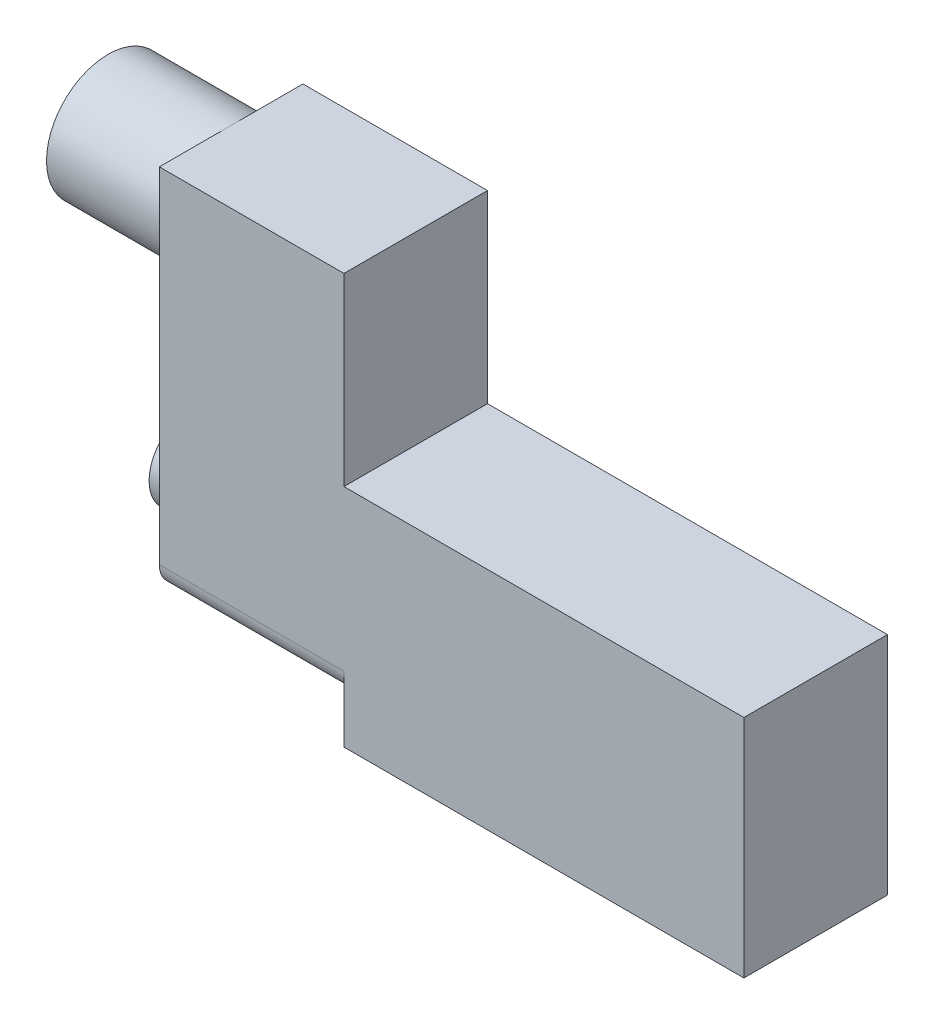
ISO-10303-21;
HEADER;
FILE_DESCRIPTION(('STEP AP214'),'2;1');
FILE_NAME('part.step','',(''),(''),'','','');
FILE_SCHEMA(('AUTOMOTIVE_DESIGN { 1 0 10303 214 1 1 1 1 }'));
ENDSEC;
DATA;
#1=APPLICATION_CONTEXT('core data for automotive mechanical design processes');
#2=APPLICATION_PROTOCOL_DEFINITION('international standard','automotive_design',2000,#1);
#3=PRODUCT_CONTEXT('',#1,'mechanical');
#4=PRODUCT('Part','Part','',(#3));
#5=PRODUCT_RELATED_PRODUCT_CATEGORY('part','',(#4));
#6=PRODUCT_DEFINITION_FORMATION('','',#4);
#7=PRODUCT_DEFINITION_CONTEXT('part definition',#1,'design');
#8=PRODUCT_DEFINITION('design','',#6,#7);
#9=PRODUCT_DEFINITION_SHAPE('','',#8);
#10=(LENGTH_UNIT() NAMED_UNIT(*) SI_UNIT(.MILLI.,.METRE.));
#11=(NAMED_UNIT(*) PLANE_ANGLE_UNIT() SI_UNIT($,.RADIAN.));
#12=(NAMED_UNIT(*) SI_UNIT($,.STERADIAN.) SOLID_ANGLE_UNIT());
#13=UNCERTAINTY_MEASURE_WITH_UNIT(LENGTH_MEASURE(1.E-05),#10,'distance_accuracy_value','');
#14=(GEOMETRIC_REPRESENTATION_CONTEXT(3) GLOBAL_UNCERTAINTY_ASSIGNED_CONTEXT((#13)) GLOBAL_UNIT_ASSIGNED_CONTEXT((#10,
#11,#12)) REPRESENTATION_CONTEXT('',''));
#15=CARTESIAN_POINT('',(0.,0.,0.));
#16=DIRECTION('',(0.,0.,1.));
#17=DIRECTION('',(1.,0.,0.));
#18=AXIS2_PLACEMENT_3D('',#15,#16,#17);
#19=CARTESIAN_POINT('',(-28.575,0.,0.));
#20=DIRECTION('',(-1.,0.,0.));
#21=DIRECTION('',(0.,0.,1.));
#22=AXIS2_PLACEMENT_3D('',#19,#20,#21);
#23=PLANE('',#22);
#24=CARTESIAN_POINT('',(-28.575,15.875,-11.1125));
#25=DIRECTION('',(-1.,0.,0.));
#26=DIRECTION('',(0.,0.,1.));
#27=AXIS2_PLACEMENT_3D('',#24,#25,#26);
#28=CIRCLE('',#27,6.35);
#29=CARTESIAN_POINT('',(-28.575,15.875,-4.76249999999999));
#30=VERTEX_POINT('',#29);
#31=EDGE_CURVE('E276',#30,#30,#28,.T.);
#32=ORIENTED_EDGE('',*,*,#31,.F.);
#33=EDGE_LOOP('',(#32));
#34=FACE_BOUND('',#33,.T.);
#35=DIRECTION('',(0.,0.,1.));
#36=VECTOR('',#35,1.);
#37=CARTESIAN_POINT('',(-28.575,63.5,-22.225));
#38=LINE('',#37,#36);
#39=CARTESIAN_POINT('',(-28.575,63.5,-11.1125));
#40=VERTEX_POINT('',#39);
#41=CARTESIAN_POINT('',(-28.575,63.5,0.));
#42=VERTEX_POINT('',#41);
#43=EDGE_CURVE('E113',#40,#42,#38,.T.);
#44=ORIENTED_EDGE('',*,*,#43,.F.);
#45=CARTESIAN_POINT('',(-28.575,53.975,-11.1125));
#46=DIRECTION('',(-1.,0.,0.));
#47=DIRECTION('',(0.,0.,1.));
#48=AXIS2_PLACEMENT_3D('',#45,#46,#47);
#49=CIRCLE('',#48,9.525);
#50=EDGE_CURVE('E48',#40,#40,#49,.T.);
#51=ORIENTED_EDGE('',*,*,#50,.F.);
#52=CARTESIAN_POINT('',(-28.575,63.5,-22.225));
#53=VERTEX_POINT('',#52);
#54=EDGE_CURVE('E121',#53,#40,#38,.T.);
#55=ORIENTED_EDGE('',*,*,#54,.F.);
#56=DIRECTION('',(0.,-1.,0.));
#57=VECTOR('',#56,1.);
#58=CARTESIAN_POINT('',(-28.575,34.925,-22.225));
#59=LINE('',#58,#57);
#60=CARTESIAN_POINT('',(-28.575,10.16,-22.225));
#61=VERTEX_POINT('',#60);
#62=EDGE_CURVE('E151',#53,#61,#59,.T.);
#63=ORIENTED_EDGE('',*,*,#62,.T.);
#64=CARTESIAN_POINT('',(-28.575,10.16,-18.415));
#65=DIRECTION('',(-1.,0.,0.));
#66=DIRECTION('',(0.,0.,1.));
#67=AXIS2_PLACEMENT_3D('',#64,#65,#66);
#68=CIRCLE('',#67,3.81);
#69=CARTESIAN_POINT('',(-28.575,6.35,-18.415));
#70=VERTEX_POINT('',#69);
#71=EDGE_CURVE('E215',#61,#70,#68,.T.);
#72=ORIENTED_EDGE('',*,*,#71,.T.);
#73=DIRECTION('',(0.,0.,1.));
#74=VECTOR('',#73,1.);
#75=CARTESIAN_POINT('',(-28.575,6.35,-22.225));
#76=LINE('',#75,#74);
#77=CARTESIAN_POINT('',(-28.575,6.35,-3.81));
#78=VERTEX_POINT('',#77);
#79=EDGE_CURVE('E134',#70,#78,#76,.T.);
#80=ORIENTED_EDGE('',*,*,#79,.T.);
#81=CARTESIAN_POINT('',(-28.575,10.16,-3.81));
#82=DIRECTION('',(-1.,0.,0.));
#83=DIRECTION('',(0.,0.,1.));
#84=AXIS2_PLACEMENT_3D('',#81,#82,#83);
#85=CIRCLE('',#84,3.81);
#86=CARTESIAN_POINT('',(-28.575,10.16,0.));
#87=VERTEX_POINT('',#86);
#88=EDGE_CURVE('E129',#78,#87,#85,.T.);
#89=ORIENTED_EDGE('',*,*,#88,.T.);
#90=DIRECTION('',(0.,1.,0.));
#91=VECTOR('',#90,1.);
#92=CARTESIAN_POINT('',(-28.575,34.925,0.));
#93=LINE('',#92,#91);
#94=EDGE_CURVE('E126',#87,#42,#93,.T.);
#95=ORIENTED_EDGE('',*,*,#94,.T.);
#96=EDGE_LOOP('',(#44,#51,#55,#63,#72,#80,#89,#95));
#97=FACE_BOUND('',#96,.T.);
#98=ADVANCED_FACE('F35',(#34,#97),#23,.T.);
#99=CARTESIAN_POINT('',(0.,34.925,0.));
#100=DIRECTION('',(0.,-1.,0.));
#101=DIRECTION('',(0.,0.,-1.));
#102=AXIS2_PLACEMENT_3D('',#99,#100,#101);
#103=PLANE('',#102);
#104=DIRECTION('',(0.,0.,-1.));
#105=VECTOR('',#104,1.);
#106=CARTESIAN_POINT('',(0.,34.925,-22.225));
#107=LINE('',#106,#105);
#108=CARTESIAN_POINT('',(0.,34.925,0.));
#109=VERTEX_POINT('',#108);
#110=CARTESIAN_POINT('',(0.,34.925,-22.225));
#111=VERTEX_POINT('',#110);
#112=EDGE_CURVE('E123',#109,#111,#107,.T.);
#113=ORIENTED_EDGE('',*,*,#112,.F.);
#114=DIRECTION('',(1.,0.,0.));
#115=VECTOR('',#114,1.);
#116=CARTESIAN_POINT('',(0.,34.925,0.));
#117=LINE('',#116,#115);
#118=CARTESIAN_POINT('',(61.9125,34.925,0.));
#119=VERTEX_POINT('',#118);
#120=EDGE_CURVE('E158',#109,#119,#117,.T.);
#121=ORIENTED_EDGE('',*,*,#120,.T.);
#122=DIRECTION('',(0.,0.,-1.));
#123=VECTOR('',#122,1.);
#124=CARTESIAN_POINT('',(61.9125,34.925,0.));
#125=LINE('',#124,#123);
#126=CARTESIAN_POINT('',(61.9125,34.925,-22.225));
#127=VERTEX_POINT('',#126);
#128=EDGE_CURVE('E177',#119,#127,#125,.T.);
#129=ORIENTED_EDGE('',*,*,#128,.T.);
#130=DIRECTION('',(-1.,0.,0.));
#131=VECTOR('',#130,1.);
#132=CARTESIAN_POINT('',(0.,34.925,-22.225));
#133=LINE('',#132,#131);
#134=EDGE_CURVE('E179',#127,#111,#133,.T.);
#135=ORIENTED_EDGE('',*,*,#134,.T.);
#136=EDGE_LOOP('',(#113,#121,#129,#135));
#137=FACE_BOUND('',#136,.T.);
#138=ADVANCED_FACE('F246',(#137),#103,.F.);
#139=CARTESIAN_POINT('',(0.,34.925,0.));
#140=DIRECTION('',(1.,0.,0.));
#141=DIRECTION('',(0.,0.,-1.));
#142=AXIS2_PLACEMENT_3D('',#139,#140,#141);
#143=PLANE('',#142);
#144=DIRECTION('',(0.,0.,1.));
#145=VECTOR('',#144,1.);
#146=CARTESIAN_POINT('',(0.,6.35,-22.225));
#147=LINE('',#146,#145);
#148=CARTESIAN_POINT('',(0.,6.35,-18.415));
#149=VERTEX_POINT('',#148);
#150=CARTESIAN_POINT('',(0.,6.35,-3.81));
#151=VERTEX_POINT('',#150);
#152=EDGE_CURVE('E166',#149,#151,#147,.T.);
#153=ORIENTED_EDGE('',*,*,#152,.F.);
#154=CARTESIAN_POINT('',(0.,10.16,-18.415));
#155=DIRECTION('',(1.,0.,0.));
#156=DIRECTION('',(0.,0.,-1.));
#157=AXIS2_PLACEMENT_3D('',#154,#155,#156);
#158=CIRCLE('',#157,3.81);
#159=CARTESIAN_POINT('',(0.,10.16,-22.225));
#160=VERTEX_POINT('',#159);
#161=EDGE_CURVE('E43',#149,#160,#158,.T.);
#162=ORIENTED_EDGE('',*,*,#161,.T.);
#163=DIRECTION('',(0.,-1.,0.));
#164=VECTOR('',#163,1.);
#165=CARTESIAN_POINT('',(0.,34.925,-22.225));
#166=LINE('',#165,#164);
#167=CARTESIAN_POINT('',(0.,0.,-22.225));
#168=VERTEX_POINT('',#167);
#169=EDGE_CURVE('E184',#160,#168,#166,.T.);
#170=ORIENTED_EDGE('',*,*,#169,.T.);
#171=DIRECTION('',(0.,0.,1.));
#172=VECTOR('',#171,1.);
#173=CARTESIAN_POINT('',(0.,0.,0.));
#174=LINE('',#173,#172);
#175=CARTESIAN_POINT('',(0.,0.,0.));
#176=VERTEX_POINT('',#175);
#177=EDGE_CURVE('E133',#168,#176,#174,.T.);
#178=ORIENTED_EDGE('',*,*,#177,.T.);
#179=DIRECTION('',(0.,-1.,0.));
#180=VECTOR('',#179,1.);
#181=CARTESIAN_POINT('',(0.,34.925,0.));
#182=LINE('',#181,#180);
#183=CARTESIAN_POINT('',(0.,10.16,0.));
#184=VERTEX_POINT('',#183);
#185=EDGE_CURVE('E54',#184,#176,#182,.T.);
#186=ORIENTED_EDGE('',*,*,#185,.F.);
#187=CARTESIAN_POINT('',(0.,10.16,-3.81));
#188=DIRECTION('',(1.,0.,0.));
#189=DIRECTION('',(0.,0.,-1.));
#190=AXIS2_PLACEMENT_3D('',#187,#188,#189);
#191=CIRCLE('',#190,3.81);
#192=EDGE_CURVE('E11',#184,#151,#191,.T.);
#193=ORIENTED_EDGE('',*,*,#192,.T.);
#194=EDGE_LOOP('',(#153,#162,#170,#178,#186,#193));
#195=FACE_BOUND('',#194,.T.);
#196=ADVANCED_FACE('F220',(#195),#143,.F.);
#197=CARTESIAN_POINT('',(0.,34.925,0.));
#198=DIRECTION('',(0.,0.,-1.));
#199=DIRECTION('',(-1.,0.,0.));
#200=AXIS2_PLACEMENT_3D('',#197,#198,#199);
#201=PLANE('',#200);
#202=ORIENTED_EDGE('',*,*,#94,.F.);
#203=DIRECTION('',(1.,0.,0.));
#204=VECTOR('',#203,1.);
#205=CARTESIAN_POINT('',(0.,10.16,0.));
#206=LINE('',#205,#204);
#207=EDGE_CURVE('E217',#87,#184,#206,.T.);
#208=ORIENTED_EDGE('',*,*,#207,.T.);
#209=ORIENTED_EDGE('',*,*,#185,.T.);
#210=DIRECTION('',(1.,0.,0.));
#211=VECTOR('',#210,1.);
#212=CARTESIAN_POINT('',(0.,0.,0.));
#213=LINE('',#212,#211);
#214=CARTESIAN_POINT('',(61.9125,0.,0.));
#215=VERTEX_POINT('',#214);
#216=EDGE_CURVE('E386',#176,#215,#213,.T.);
#217=ORIENTED_EDGE('',*,*,#216,.T.);
#218=DIRECTION('',(0.,-1.,0.));
#219=VECTOR('',#218,1.);
#220=CARTESIAN_POINT('',(61.9125,34.925,0.));
#221=LINE('',#220,#219);
#222=EDGE_CURVE('E196',#119,#215,#221,.T.);
#223=ORIENTED_EDGE('',*,*,#222,.F.);
#224=ORIENTED_EDGE('',*,*,#120,.F.);
#225=DIRECTION('',(0.,-1.,0.));
#226=VECTOR('',#225,1.);
#227=CARTESIAN_POINT('',(0.,63.5,0.));
#228=LINE('',#227,#226);
#229=CARTESIAN_POINT('',(0.,63.5,0.));
#230=VERTEX_POINT('',#229);
#231=EDGE_CURVE('E139',#230,#109,#228,.T.);
#232=ORIENTED_EDGE('',*,*,#231,.F.);
#233=DIRECTION('',(1.,0.,0.));
#234=VECTOR('',#233,1.);
#235=CARTESIAN_POINT('',(-28.575,63.5,0.));
#236=LINE('',#235,#234);
#237=EDGE_CURVE('E117',#42,#230,#236,.T.);
#238=ORIENTED_EDGE('',*,*,#237,.F.);
#239=EDGE_LOOP('',(#202,#208,#209,#217,#223,#224,#232,#238));
#240=FACE_BOUND('',#239,.T.);
#241=ADVANCED_FACE('F136',(#240),#201,.F.);
#242=CARTESIAN_POINT('',(61.9125,34.925,0.));
#243=DIRECTION('',(-1.,0.,0.));
#244=DIRECTION('',(0.,0.,1.));
#245=AXIS2_PLACEMENT_3D('',#242,#243,#244);
#246=PLANE('',#245);
#247=DIRECTION('',(0.,0.,-1.));
#248=VECTOR('',#247,1.);
#249=CARTESIAN_POINT('',(61.9125,0.,0.));
#250=LINE('',#249,#248);
#251=CARTESIAN_POINT('',(61.9125,0.,-22.225));
#252=VERTEX_POINT('',#251);
#253=EDGE_CURVE('E383',#215,#252,#250,.T.);
#254=ORIENTED_EDGE('',*,*,#253,.T.);
#255=DIRECTION('',(0.,-1.,0.));
#256=VECTOR('',#255,1.);
#257=CARTESIAN_POINT('',(61.9125,34.925,-22.225));
#258=LINE('',#257,#256);
#259=EDGE_CURVE('E187',#127,#252,#258,.T.);
#260=ORIENTED_EDGE('',*,*,#259,.F.);
#261=ORIENTED_EDGE('',*,*,#128,.F.);
#262=ORIENTED_EDGE('',*,*,#222,.T.);
#263=EDGE_LOOP('',(#254,#260,#261,#262));
#264=FACE_BOUND('',#263,.T.);
#265=ADVANCED_FACE('F339',(#264),#246,.F.);
#266=CARTESIAN_POINT('',(0.,34.925,-22.225));
#267=DIRECTION('',(0.,0.,1.));
#268=DIRECTION('',(1.,0.,0.));
#269=AXIS2_PLACEMENT_3D('',#266,#267,#268);
#270=PLANE('',#269);
#271=ORIENTED_EDGE('',*,*,#169,.F.);
#272=DIRECTION('',(1.,0.,0.));
#273=VECTOR('',#272,1.);
#274=CARTESIAN_POINT('',(0.,10.16,-22.225));
#275=LINE('',#274,#273);
#276=EDGE_CURVE('E209',#160,#61,#275,.F.);
#277=ORIENTED_EDGE('',*,*,#276,.T.);
#278=ORIENTED_EDGE('',*,*,#62,.F.);
#279=DIRECTION('',(-1.,0.,0.));
#280=VECTOR('',#279,1.);
#281=CARTESIAN_POINT('',(-28.575,63.5,-22.225));
#282=LINE('',#281,#280);
#283=CARTESIAN_POINT('',(0.,63.5,-22.225));
#284=VERTEX_POINT('',#283);
#285=EDGE_CURVE('E143',#284,#53,#282,.T.);
#286=ORIENTED_EDGE('',*,*,#285,.F.);
#287=DIRECTION('',(0.,-1.,0.));
#288=VECTOR('',#287,1.);
#289=CARTESIAN_POINT('',(0.,63.5,-22.225));
#290=LINE('',#289,#288);
#291=EDGE_CURVE('E148',#284,#111,#290,.T.);
#292=ORIENTED_EDGE('',*,*,#291,.T.);
#293=ORIENTED_EDGE('',*,*,#134,.F.);
#294=ORIENTED_EDGE('',*,*,#259,.T.);
#295=DIRECTION('',(-1.,0.,0.));
#296=VECTOR('',#295,1.);
#297=CARTESIAN_POINT('',(0.,0.,-22.225));
#298=LINE('',#297,#296);
#299=EDGE_CURVE('E192',#252,#168,#298,.T.);
#300=ORIENTED_EDGE('',*,*,#299,.T.);
#301=EDGE_LOOP('',(#271,#277,#278,#286,#292,#293,#294,#300));
#302=FACE_BOUND('',#301,.T.);
#303=ADVANCED_FACE('F227',(#302),#270,.F.);
#304=CARTESIAN_POINT('',(0.,0.,0.));
#305=DIRECTION('',(0.,-1.,0.));
#306=DIRECTION('',(0.,0.,-1.));
#307=AXIS2_PLACEMENT_3D('',#304,#305,#306);
#308=PLANE('',#307);
#309=ORIENTED_EDGE('',*,*,#177,.F.);
#310=ORIENTED_EDGE('',*,*,#299,.F.);
#311=ORIENTED_EDGE('',*,*,#253,.F.);
#312=ORIENTED_EDGE('',*,*,#216,.F.);
#313=EDGE_LOOP('',(#309,#310,#311,#312));
#314=FACE_BOUND('',#313,.T.);
#315=ADVANCED_FACE('F233',(#314),#308,.T.);
#316=CARTESIAN_POINT('',(-28.575,6.35,-22.225));
#317=DIRECTION('',(0.,1.,0.));
#318=DIRECTION('',(0.,0.,1.));
#319=AXIS2_PLACEMENT_3D('',#316,#317,#318);
#320=PLANE('',#319);
#321=ORIENTED_EDGE('',*,*,#79,.F.);
#322=DIRECTION('',(1.,0.,0.));
#323=VECTOR('',#322,1.);
#324=CARTESIAN_POINT('',(-28.575,6.35,-18.415));
#325=LINE('',#324,#323);
#326=EDGE_CURVE('E204',#70,#149,#325,.T.);
#327=ORIENTED_EDGE('',*,*,#326,.T.);
#328=ORIENTED_EDGE('',*,*,#152,.T.);
#329=DIRECTION('',(1.,0.,0.));
#330=VECTOR('',#329,1.);
#331=CARTESIAN_POINT('',(-28.575,6.35,-3.81));
#332=LINE('',#331,#330);
#333=EDGE_CURVE('E172',#151,#78,#332,.F.);
#334=ORIENTED_EDGE('',*,*,#333,.T.);
#335=EDGE_LOOP('',(#321,#327,#328,#334));
#336=FACE_BOUND('',#335,.T.);
#337=ADVANCED_FACE('F230',(#336),#320,.F.);
#338=CARTESIAN_POINT('',(0.,63.5,-22.225));
#339=DIRECTION('',(-1.,0.,0.));
#340=DIRECTION('',(0.,0.,1.));
#341=AXIS2_PLACEMENT_3D('',#338,#339,#340);
#342=PLANE('',#341);
#343=ORIENTED_EDGE('',*,*,#112,.T.);
#344=ORIENTED_EDGE('',*,*,#291,.F.);
#345=DIRECTION('',(0.,0.,-1.));
#346=VECTOR('',#345,1.);
#347=CARTESIAN_POINT('',(0.,63.5,-22.225));
#348=LINE('',#347,#346);
#349=EDGE_CURVE('E141',#230,#284,#348,.T.);
#350=ORIENTED_EDGE('',*,*,#349,.F.);
#351=ORIENTED_EDGE('',*,*,#231,.T.);
#352=EDGE_LOOP('',(#343,#344,#350,#351));
#353=FACE_BOUND('',#352,.T.);
#354=ADVANCED_FACE('F232',(#353),#342,.F.);
#355=CARTESIAN_POINT('',(0.,63.5,0.));
#356=DIRECTION('',(0.,1.,0.));
#357=DIRECTION('',(0.,0.,1.));
#358=AXIS2_PLACEMENT_3D('',#355,#356,#357);
#359=PLANE('',#358);
#360=ORIENTED_EDGE('',*,*,#54,.T.);
#361=ORIENTED_EDGE('',*,*,#43,.T.);
#362=ORIENTED_EDGE('',*,*,#237,.T.);
#363=ORIENTED_EDGE('',*,*,#349,.T.);
#364=ORIENTED_EDGE('',*,*,#285,.T.);
#365=EDGE_LOOP('',(#360,#361,#362,#363,#364));
#366=FACE_BOUND('',#365,.T.);
#367=ADVANCED_FACE('F115',(#366),#359,.T.);
#368=CARTESIAN_POINT('',(-34.925,15.875,-11.1125));
#369=DIRECTION('',(1.,0.,0.));
#370=DIRECTION('',(0.,0.,-1.));
#371=AXIS2_PLACEMENT_3D('',#368,#369,#370);
#372=CYLINDRICAL_SURFACE('',#371,6.35);
#373=CARTESIAN_POINT('',(-34.925,15.875,-11.1125));
#374=DIRECTION('',(-1.,0.,0.));
#375=DIRECTION('',(0.,0.,1.));
#376=AXIS2_PLACEMENT_3D('',#373,#374,#375);
#377=CIRCLE('',#376,6.35);
#378=CARTESIAN_POINT('',(-34.925,15.875,-4.76249999999999));
#379=VERTEX_POINT('',#378);
#380=EDGE_CURVE('E157',#379,#379,#377,.T.);
#381=ORIENTED_EDGE('',*,*,#380,.F.);
#382=EDGE_LOOP('',(#381));
#383=FACE_BOUND('',#382,.T.);
#384=ORIENTED_EDGE('',*,*,#31,.T.);
#385=EDGE_LOOP('',(#384));
#386=FACE_BOUND('',#385,.T.);
#387=ADVANCED_FACE('F256',(#383,#386),#372,.T.);
#388=CARTESIAN_POINT('',(-34.925,15.875,-11.1125));
#389=DIRECTION('',(-1.,0.,0.));
#390=DIRECTION('',(0.,0.,1.));
#391=AXIS2_PLACEMENT_3D('',#388,#389,#390);
#392=PLANE('',#391);
#393=ORIENTED_EDGE('',*,*,#380,.T.);
#394=EDGE_LOOP('',(#393));
#395=FACE_BOUND('',#394,.T.);
#396=ADVANCED_FACE('F259',(#395),#392,.T.);
#397=CARTESIAN_POINT('',(-28.575,10.16,-18.415));
#398=DIRECTION('',(1.,0.,0.));
#399=DIRECTION('',(0.,0.,-1.));
#400=AXIS2_PLACEMENT_3D('',#397,#398,#399);
#401=CYLINDRICAL_SURFACE('',#400,3.81);
#402=ORIENTED_EDGE('',*,*,#71,.F.);
#403=ORIENTED_EDGE('',*,*,#276,.F.);
#404=ORIENTED_EDGE('',*,*,#161,.F.);
#405=ORIENTED_EDGE('',*,*,#326,.F.);
#406=EDGE_LOOP('',(#402,#403,#404,#405));
#407=FACE_BOUND('',#406,.T.);
#408=ADVANCED_FACE('F224',(#407),#401,.T.);
#409=CARTESIAN_POINT('',(0.,10.16,-3.81));
#410=DIRECTION('',(1.,0.,0.));
#411=DIRECTION('',(0.,0.,-1.));
#412=AXIS2_PLACEMENT_3D('',#409,#410,#411);
#413=CYLINDRICAL_SURFACE('',#412,3.81);
#414=ORIENTED_EDGE('',*,*,#88,.F.);
#415=ORIENTED_EDGE('',*,*,#333,.F.);
#416=ORIENTED_EDGE('',*,*,#192,.F.);
#417=ORIENTED_EDGE('',*,*,#207,.F.);
#418=EDGE_LOOP('',(#414,#415,#416,#417));
#419=FACE_BOUND('',#418,.T.);
#420=ADVANCED_FACE('F37',(#419),#413,.T.);
#421=CARTESIAN_POINT('',(-47.625,53.975,-11.1125));
#422=DIRECTION('',(1.,0.,0.));
#423=DIRECTION('',(0.,0.,-1.));
#424=AXIS2_PLACEMENT_3D('',#421,#422,#423);
#425=CYLINDRICAL_SURFACE('',#424,9.525);
#426=CARTESIAN_POINT('',(-47.625,53.975,-11.1125));
#427=DIRECTION('',(-1.,0.,0.));
#428=DIRECTION('',(0.,0.,1.));
#429=AXIS2_PLACEMENT_3D('',#426,#427,#428);
#430=CIRCLE('',#429,9.525);
#431=CARTESIAN_POINT('',(-47.625,53.975,-1.5875));
#432=VERTEX_POINT('',#431);
#433=EDGE_CURVE('E275',#432,#432,#430,.T.);
#434=ORIENTED_EDGE('',*,*,#433,.F.);
#435=EDGE_LOOP('',(#434));
#436=FACE_BOUND('',#435,.T.);
#437=ORIENTED_EDGE('',*,*,#50,.T.);
#438=EDGE_LOOP('',(#437));
#439=FACE_BOUND('',#438,.T.);
#440=ADVANCED_FACE('F264',(#436,#439),#425,.T.);
#441=CARTESIAN_POINT('',(-47.625,53.975,-11.1125));
#442=DIRECTION('',(-1.,0.,0.));
#443=DIRECTION('',(0.,0.,1.));
#444=AXIS2_PLACEMENT_3D('',#441,#442,#443);
#445=PLANE('',#444);
#446=ORIENTED_EDGE('',*,*,#433,.T.);
#447=EDGE_LOOP('',(#446));
#448=FACE_BOUND('',#447,.T.);
#449=ADVANCED_FACE('F267',(#448),#445,.T.);
#450=CLOSED_SHELL('',(#98,#138,#196,#241,#265,#303,#315,#337,#354,#367,#387,#396,#408,#420,#440,#449));
#451=MANIFOLD_SOLID_BREP('B2',#450);
#452=ADVANCED_BREP_SHAPE_REPRESENTATION('',(#18,#451),#14);
#453=SHAPE_DEFINITION_REPRESENTATION(#9,#452);
ENDSEC;
END-ISO-10303-21;
